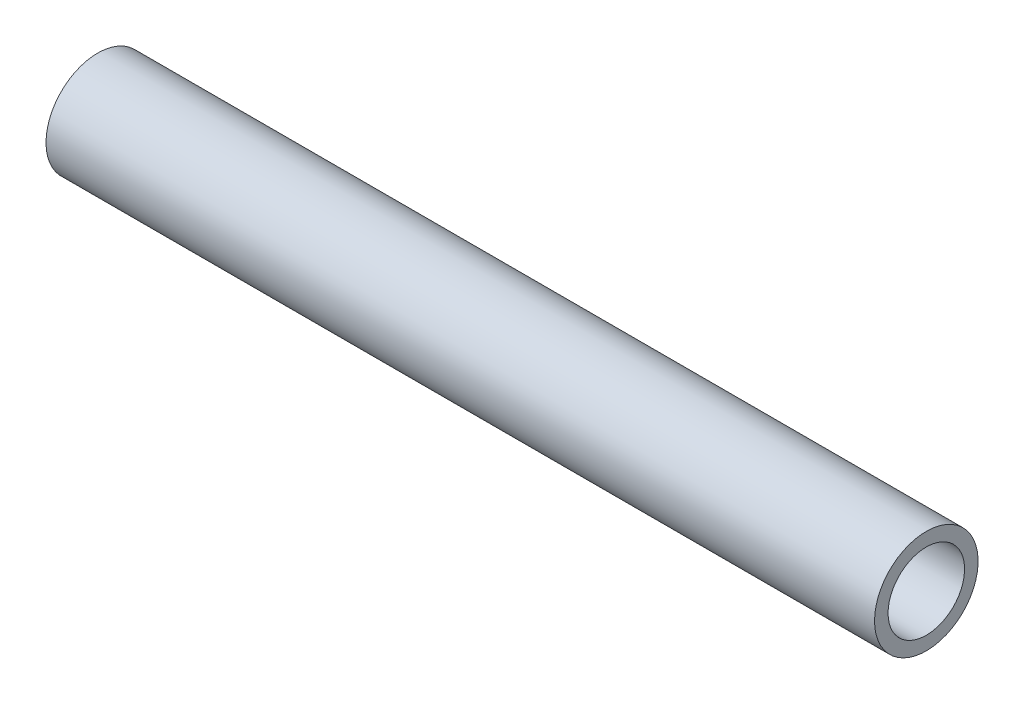
ISO-10303-21;
HEADER;
FILE_DESCRIPTION(('STEP AP214'),'2;1');
FILE_NAME('part.step','',(''),(''),'','','');
FILE_SCHEMA(('AUTOMOTIVE_DESIGN { 1 0 10303 214 1 1 1 1 }'));
ENDSEC;
DATA;
#1=APPLICATION_CONTEXT('core data for automotive mechanical design processes');
#2=APPLICATION_PROTOCOL_DEFINITION('international standard','automotive_design',2000,#1);
#3=PRODUCT_CONTEXT('',#1,'mechanical');
#4=PRODUCT('Part','Part','',(#3));
#5=PRODUCT_RELATED_PRODUCT_CATEGORY('part','',(#4));
#6=PRODUCT_DEFINITION_FORMATION('','',#4);
#7=PRODUCT_DEFINITION_CONTEXT('part definition',#1,'design');
#8=PRODUCT_DEFINITION('design','',#6,#7);
#9=PRODUCT_DEFINITION_SHAPE('','',#8);
#10=(LENGTH_UNIT() NAMED_UNIT(*) SI_UNIT(.MILLI.,.METRE.));
#11=(NAMED_UNIT(*) PLANE_ANGLE_UNIT() SI_UNIT($,.RADIAN.));
#12=(NAMED_UNIT(*) SI_UNIT($,.STERADIAN.) SOLID_ANGLE_UNIT());
#13=UNCERTAINTY_MEASURE_WITH_UNIT(LENGTH_MEASURE(1.E-05),#10,'distance_accuracy_value','');
#14=(GEOMETRIC_REPRESENTATION_CONTEXT(3) GLOBAL_UNCERTAINTY_ASSIGNED_CONTEXT((#13)) GLOBAL_UNIT_ASSIGNED_CONTEXT((#10,
#11,#12)) REPRESENTATION_CONTEXT('',''));
#15=CARTESIAN_POINT('',(0.,0.,0.));
#16=DIRECTION('',(0.,0.,1.));
#17=DIRECTION('',(1.,0.,0.));
#18=AXIS2_PLACEMENT_3D('',#15,#16,#17);
#19=CARTESIAN_POINT('',(38.1,0.,0.));
#20=DIRECTION('',(1.,0.,0.));
#21=DIRECTION('',(0.,0.,-1.));
#22=AXIS2_PLACEMENT_3D('',#19,#20,#21);
#23=PLANE('',#22);
#24=CARTESIAN_POINT('',(38.1,0.,0.));
#25=DIRECTION('',(1.,0.,0.));
#26=DIRECTION('',(0.,0.,-1.));
#27=AXIS2_PLACEMENT_3D('',#24,#25,#26);
#28=CIRCLE('',#27,4.7625);
#29=CARTESIAN_POINT('',(38.1,0.,4.7625));
#30=VERTEX_POINT('',#29);
#31=EDGE_CURVE('E10',#30,#30,#28,.T.);
#32=ORIENTED_EDGE('',*,*,#31,.T.);
#33=EDGE_LOOP('',(#32));
#34=FACE_BOUND('',#33,.T.);
#35=CARTESIAN_POINT('',(38.1,0.,0.));
#36=DIRECTION('',(1.,0.,0.));
#37=DIRECTION('',(0.,0.,-1.));
#38=AXIS2_PLACEMENT_3D('',#35,#36,#37);
#39=CIRCLE('',#38,3.5179);
#40=CARTESIAN_POINT('',(38.1,0.,3.5179));
#41=VERTEX_POINT('',#40);
#42=EDGE_CURVE('E46',#41,#41,#39,.T.);
#43=ORIENTED_EDGE('',*,*,#42,.F.);
#44=EDGE_LOOP('',(#43));
#45=FACE_BOUND('',#44,.T.);
#46=ADVANCED_FACE('F35',(#34,#45),#23,.T.);
#47=CARTESIAN_POINT('',(-38.1,0.,0.));
#48=DIRECTION('',(1.,0.,0.));
#49=DIRECTION('',(0.,0.,-1.));
#50=AXIS2_PLACEMENT_3D('',#47,#48,#49);
#51=PLANE('',#50);
#52=CARTESIAN_POINT('',(-38.1,0.,0.));
#53=DIRECTION('',(1.,0.,0.));
#54=DIRECTION('',(0.,0.,-1.));
#55=AXIS2_PLACEMENT_3D('',#52,#53,#54);
#56=CIRCLE('',#55,4.7625);
#57=CARTESIAN_POINT('',(-38.1,0.,4.7625));
#58=VERTEX_POINT('',#57);
#59=EDGE_CURVE('E39',#58,#58,#56,.T.);
#60=ORIENTED_EDGE('',*,*,#59,.F.);
#61=EDGE_LOOP('',(#60));
#62=FACE_BOUND('',#61,.T.);
#63=CARTESIAN_POINT('',(-38.1,0.,0.));
#64=DIRECTION('',(1.,0.,0.));
#65=DIRECTION('',(0.,0.,-1.));
#66=AXIS2_PLACEMENT_3D('',#63,#64,#65);
#67=CIRCLE('',#66,3.5179);
#68=CARTESIAN_POINT('',(-38.1,0.,3.5179));
#69=VERTEX_POINT('',#68);
#70=EDGE_CURVE('E48',#69,#69,#67,.T.);
#71=ORIENTED_EDGE('',*,*,#70,.T.);
#72=EDGE_LOOP('',(#71));
#73=FACE_BOUND('',#72,.T.);
#74=ADVANCED_FACE('F58',(#62,#73),#51,.F.);
#75=CARTESIAN_POINT('',(38.1,0.,0.));
#76=DIRECTION('',(-1.,0.,0.));
#77=DIRECTION('',(0.,0.,1.));
#78=AXIS2_PLACEMENT_3D('',#75,#76,#77);
#79=CYLINDRICAL_SURFACE('',#78,4.7625);
#80=CARTESIAN_POINT('',(38.1,0.,4.7625));
#81=CARTESIAN_POINT('',(37.30625,0.,4.7625));
#82=CARTESIAN_POINT('',(36.5125,0.,4.7625));
#83=CARTESIAN_POINT('',(34.925,0.,4.7625));
#84=CARTESIAN_POINT('',(34.13125,0.,4.7625));
#85=CARTESIAN_POINT('',(32.54375,0.,4.7625));
#86=CARTESIAN_POINT('',(31.75,0.,4.7625));
#87=CARTESIAN_POINT('',(30.1625,0.,4.7625));
#88=CARTESIAN_POINT('',(29.36875,0.,4.7625));
#89=CARTESIAN_POINT('',(27.78125,0.,4.7625));
#90=CARTESIAN_POINT('',(26.9875,0.,4.7625));
#91=CARTESIAN_POINT('',(25.4,0.,4.7625));
#92=CARTESIAN_POINT('',(24.60625,0.,4.7625));
#93=CARTESIAN_POINT('',(23.01875,0.,4.7625));
#94=CARTESIAN_POINT('',(22.225,0.,4.7625));
#95=CARTESIAN_POINT('',(20.6375,0.,4.7625));
#96=CARTESIAN_POINT('',(19.84375,0.,4.7625));
#97=CARTESIAN_POINT('',(18.25625,0.,4.7625));
#98=CARTESIAN_POINT('',(17.4625,0.,4.7625));
#99=CARTESIAN_POINT('',(15.875,0.,4.7625));
#100=CARTESIAN_POINT('',(15.08125,0.,4.7625));
#101=CARTESIAN_POINT('',(13.49375,0.,4.7625));
#102=CARTESIAN_POINT('',(12.7,0.,4.7625));
#103=CARTESIAN_POINT('',(11.1125,0.,4.7625));
#104=CARTESIAN_POINT('',(10.31875,0.,4.7625));
#105=CARTESIAN_POINT('',(8.73124999999999,0.,4.7625));
#106=CARTESIAN_POINT('',(7.93749999999999,0.,4.7625));
#107=CARTESIAN_POINT('',(6.35,0.,4.7625));
#108=CARTESIAN_POINT('',(5.55625,0.,4.7625));
#109=CARTESIAN_POINT('',(3.96875,0.,4.7625));
#110=CARTESIAN_POINT('',(3.175,0.,4.7625));
#111=CARTESIAN_POINT('',(1.5875,0.,4.7625));
#112=CARTESIAN_POINT('',(0.793750000000001,0.,4.7625));
#113=CARTESIAN_POINT('',(-0.793750000000001,0.,4.7625));
#114=CARTESIAN_POINT('',(-1.5875,0.,4.7625));
#115=CARTESIAN_POINT('',(-3.175,0.,4.7625));
#116=CARTESIAN_POINT('',(-3.96875,0.,4.7625));
#117=CARTESIAN_POINT('',(-5.55625,0.,4.7625));
#118=CARTESIAN_POINT('',(-6.35,0.,4.7625));
#119=CARTESIAN_POINT('',(-7.93750000000001,0.,4.7625));
#120=CARTESIAN_POINT('',(-8.73125,0.,4.7625));
#121=CARTESIAN_POINT('',(-10.31875,0.,4.7625));
#122=CARTESIAN_POINT('',(-11.1125,0.,4.7625));
#123=CARTESIAN_POINT('',(-12.7,0.,4.7625));
#124=CARTESIAN_POINT('',(-13.49375,0.,4.7625));
#125=CARTESIAN_POINT('',(-15.08125,0.,4.7625));
#126=CARTESIAN_POINT('',(-15.875,0.,4.7625));
#127=CARTESIAN_POINT('',(-17.4625,0.,4.7625));
#128=CARTESIAN_POINT('',(-18.25625,0.,4.7625));
#129=CARTESIAN_POINT('',(-19.84375,0.,4.7625));
#130=CARTESIAN_POINT('',(-20.6375,0.,4.7625));
#131=CARTESIAN_POINT('',(-22.225,0.,4.7625));
#132=CARTESIAN_POINT('',(-23.01875,0.,4.7625));
#133=CARTESIAN_POINT('',(-24.60625,0.,4.7625));
#134=CARTESIAN_POINT('',(-25.4,0.,4.7625));
#135=CARTESIAN_POINT('',(-26.9875,0.,4.7625));
#136=CARTESIAN_POINT('',(-27.78125,0.,4.7625));
#137=CARTESIAN_POINT('',(-29.36875,0.,4.7625));
#138=CARTESIAN_POINT('',(-30.1625,0.,4.7625));
#139=CARTESIAN_POINT('',(-31.75,0.,4.7625));
#140=CARTESIAN_POINT('',(-32.54375,0.,4.7625));
#141=CARTESIAN_POINT('',(-34.13125,0.,4.7625));
#142=CARTESIAN_POINT('',(-34.925,0.,4.7625));
#143=CARTESIAN_POINT('',(-36.5125,0.,4.7625));
#144=CARTESIAN_POINT('',(-37.30625,0.,4.7625));
#145=CARTESIAN_POINT('',(-38.1,0.,4.7625));
#146=B_SPLINE_CURVE_WITH_KNOTS('',3,(#80,#81,#82,#83,#84,#85,#86,#87,#88,#89,#90,#91,#92,#93,
#94,#95,#96,#97,#98,#99,#100,#101,#102,#103,#104,#105,#106,#107,#108,#109,#110,#111,#112,#113,
#114,#115,#116,#117,#118,#119,#120,#121,#122,#123,#124,#125,#126,#127,#128,#129,#130,#131,#132,
#133,#134,#135,#136,#137,#138,#139,#140,#141,#142,#143,#144,#145),.UNSPECIFIED.,.F.,.F.,(4,2,2,
2,2,2,2,2,2,2,2,2,2,2,2,2,2,2,2,2,2,2,2,2,2,2,2,2,2,2,2,2,4),(0.,2.38125,4.7625,7.14375,
9.52500000000001,11.90625,14.2875,16.66875,19.05,21.43125,23.8125,26.19375,28.575,30.95625,
33.3375,35.71875,38.1,40.48125,42.8625,45.24375,47.625,50.00625,52.3875,54.76875,57.15,59.53125,
61.9125,64.29375,66.675,69.05625,71.4375,73.81875,76.2),.UNSPECIFIED.);
#147=EDGE_CURVE('BSEAM37',#30,#58,#146,.T.);
#148=ORIENTED_EDGE('',*,*,#31,.F.);
#149=ORIENTED_EDGE('',*,*,#59,.T.);
#150=ORIENTED_EDGE('',*,*,#147,.T.);
#151=ORIENTED_EDGE('',*,*,#147,.F.);
#152=EDGE_LOOP('',(#148,#150,#149,#151));
#153=FACE_BOUND('',#152,.T.);
#154=ADVANCED_FACE('F37',(#153),#79,.T.);
#155=CARTESIAN_POINT('',(38.1,0.,0.));
#156=DIRECTION('',(-1.,0.,0.));
#157=DIRECTION('',(0.,0.,1.));
#158=AXIS2_PLACEMENT_3D('',#155,#156,#157);
#159=CYLINDRICAL_SURFACE('',#158,3.5179);
#160=CARTESIAN_POINT('',(38.1,0.,3.5179));
#161=CARTESIAN_POINT('',(37.30625,0.,3.5179));
#162=CARTESIAN_POINT('',(36.5125,0.,3.5179));
#163=CARTESIAN_POINT('',(34.925,0.,3.5179));
#164=CARTESIAN_POINT('',(34.13125,0.,3.5179));
#165=CARTESIAN_POINT('',(32.54375,0.,3.5179));
#166=CARTESIAN_POINT('',(31.75,0.,3.5179));
#167=CARTESIAN_POINT('',(30.1625,0.,3.5179));
#168=CARTESIAN_POINT('',(29.36875,0.,3.5179));
#169=CARTESIAN_POINT('',(27.78125,0.,3.5179));
#170=CARTESIAN_POINT('',(26.9875,0.,3.5179));
#171=CARTESIAN_POINT('',(25.4,0.,3.5179));
#172=CARTESIAN_POINT('',(24.60625,0.,3.5179));
#173=CARTESIAN_POINT('',(23.01875,0.,3.5179));
#174=CARTESIAN_POINT('',(22.225,0.,3.5179));
#175=CARTESIAN_POINT('',(20.6375,0.,3.5179));
#176=CARTESIAN_POINT('',(19.84375,0.,3.5179));
#177=CARTESIAN_POINT('',(18.25625,0.,3.5179));
#178=CARTESIAN_POINT('',(17.4625,0.,3.5179));
#179=CARTESIAN_POINT('',(15.875,0.,3.5179));
#180=CARTESIAN_POINT('',(15.08125,0.,3.5179));
#181=CARTESIAN_POINT('',(13.49375,0.,3.5179));
#182=CARTESIAN_POINT('',(12.7,0.,3.5179));
#183=CARTESIAN_POINT('',(11.1125,0.,3.5179));
#184=CARTESIAN_POINT('',(10.31875,0.,3.5179));
#185=CARTESIAN_POINT('',(8.73124999999999,0.,3.5179));
#186=CARTESIAN_POINT('',(7.93749999999999,0.,3.5179));
#187=CARTESIAN_POINT('',(6.34999999999999,0.,3.5179));
#188=CARTESIAN_POINT('',(5.55625,0.,3.5179));
#189=CARTESIAN_POINT('',(3.96875,0.,3.5179));
#190=CARTESIAN_POINT('',(3.17499999999999,0.,3.5179));
#191=CARTESIAN_POINT('',(1.58749999999999,0.,3.5179));
#192=CARTESIAN_POINT('',(0.793749999999994,0.,3.5179));
#193=CARTESIAN_POINT('',(-0.793750000000007,0.,3.5179));
#194=CARTESIAN_POINT('',(-1.58750000000001,0.,3.5179));
#195=CARTESIAN_POINT('',(-3.17500000000001,0.,3.5179));
#196=CARTESIAN_POINT('',(-3.96875000000001,0.,3.5179));
#197=CARTESIAN_POINT('',(-5.55625000000001,0.,3.5179));
#198=CARTESIAN_POINT('',(-6.35000000000001,0.,3.5179));
#199=CARTESIAN_POINT('',(-7.93750000000001,0.,3.5179));
#200=CARTESIAN_POINT('',(-8.73125000000001,0.,3.5179));
#201=CARTESIAN_POINT('',(-10.31875,0.,3.5179));
#202=CARTESIAN_POINT('',(-11.1125,0.,3.5179));
#203=CARTESIAN_POINT('',(-12.7,0.,3.5179));
#204=CARTESIAN_POINT('',(-13.49375,0.,3.5179));
#205=CARTESIAN_POINT('',(-15.08125,0.,3.5179));
#206=CARTESIAN_POINT('',(-15.875,0.,3.5179));
#207=CARTESIAN_POINT('',(-17.4625,0.,3.5179));
#208=CARTESIAN_POINT('',(-18.25625,0.,3.5179));
#209=CARTESIAN_POINT('',(-19.84375,0.,3.5179));
#210=CARTESIAN_POINT('',(-20.6375,0.,3.5179));
#211=CARTESIAN_POINT('',(-22.225,0.,3.5179));
#212=CARTESIAN_POINT('',(-23.01875,0.,3.5179));
#213=CARTESIAN_POINT('',(-24.60625,0.,3.5179));
#214=CARTESIAN_POINT('',(-25.4,0.,3.5179));
#215=CARTESIAN_POINT('',(-26.9875,0.,3.5179));
#216=CARTESIAN_POINT('',(-27.78125,0.,3.5179));
#217=CARTESIAN_POINT('',(-29.36875,0.,3.5179));
#218=CARTESIAN_POINT('',(-30.1625,0.,3.5179));
#219=CARTESIAN_POINT('',(-31.75,0.,3.5179));
#220=CARTESIAN_POINT('',(-32.54375,0.,3.5179));
#221=CARTESIAN_POINT('',(-34.13125,0.,3.5179));
#222=CARTESIAN_POINT('',(-34.925,0.,3.5179));
#223=CARTESIAN_POINT('',(-36.5125,0.,3.5179));
#224=CARTESIAN_POINT('',(-37.30625,0.,3.5179));
#225=CARTESIAN_POINT('',(-38.1,0.,3.5179));
#226=B_SPLINE_CURVE_WITH_KNOTS('',3,(#160,#161,#162,#163,#164,#165,#166,#167,#168,#169,#170,
#171,#172,#173,#174,#175,#176,#177,#178,#179,#180,#181,#182,#183,#184,#185,#186,#187,#188,#189,
#190,#191,#192,#193,#194,#195,#196,#197,#198,#199,#200,#201,#202,#203,#204,#205,#206,#207,#208,
#209,#210,#211,#212,#213,#214,#215,#216,#217,#218,#219,#220,#221,#222,#223,#224,#225),
.UNSPECIFIED.,.F.,.F.,(4,2,2,2,2,2,2,2,2,2,2,2,2,2,2,2,2,2,2,2,2,2,2,2,2,2,2,2,2,2,2,2,4),(0.,
2.38124999999999,4.7625,7.14375,9.525,11.90625,14.2875,16.66875,19.05,21.43125,23.8125,26.19375,
28.575,30.95625,33.3375,35.71875,38.1,40.48125,42.8625,45.24375,47.625,50.00625,52.3875,
54.76875,57.15,59.53125,61.9125,64.29375,66.675,69.05625,71.4375,73.81875,76.2),.UNSPECIFIED.);
#227=EDGE_CURVE('BSEAM54',#41,#69,#226,.T.);
#228=ORIENTED_EDGE('',*,*,#42,.T.);
#229=ORIENTED_EDGE('',*,*,#70,.F.);
#230=ORIENTED_EDGE('',*,*,#227,.T.);
#231=ORIENTED_EDGE('',*,*,#227,.F.);
#232=EDGE_LOOP('',(#228,#230,#229,#231));
#233=FACE_BOUND('',#232,.T.);
#234=ADVANCED_FACE('F54',(#233),#159,.F.);
#235=CLOSED_SHELL('',(#46,#74,#154,#234));
#236=MANIFOLD_SOLID_BREP('B2',#235);
#237=ADVANCED_BREP_SHAPE_REPRESENTATION('',(#18,#236),#14);
#238=SHAPE_DEFINITION_REPRESENTATION(#9,#237);
ENDSEC;
END-ISO-10303-21;
